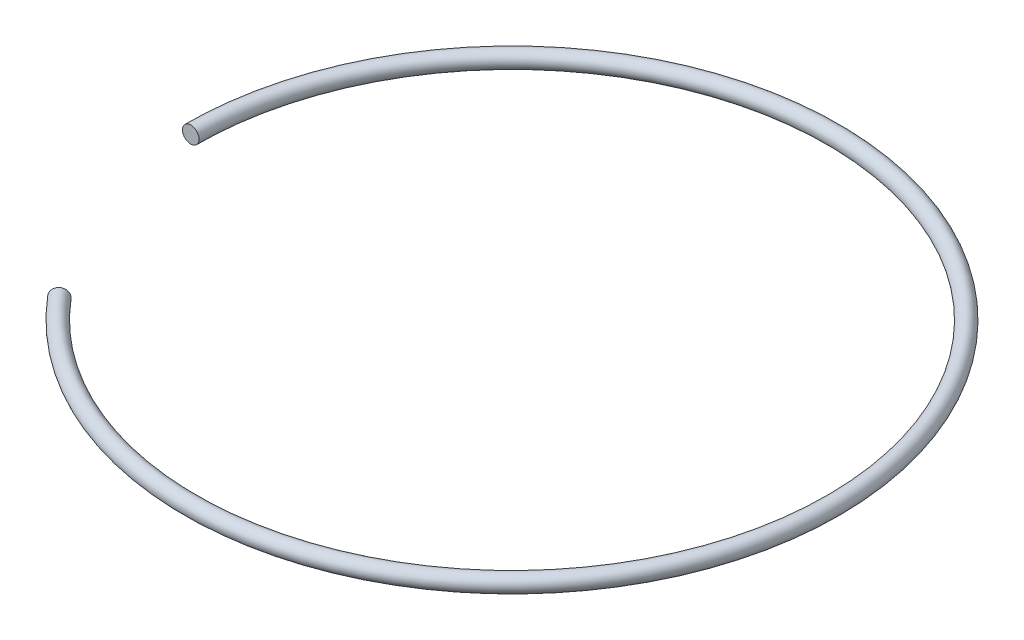
ISO-10303-21;
HEADER;
FILE_DESCRIPTION(('STEP AP214'),'2;1');
FILE_NAME('part.step','',(''),(''),'','','');
FILE_SCHEMA(('AUTOMOTIVE_DESIGN { 1 0 10303 214 1 1 1 1 }'));
ENDSEC;
DATA;
#1=APPLICATION_CONTEXT('core data for automotive mechanical design processes');
#2=APPLICATION_PROTOCOL_DEFINITION('international standard','automotive_design',2000,#1);
#3=PRODUCT_CONTEXT('',#1,'mechanical');
#4=PRODUCT('Part','Part','',(#3));
#5=PRODUCT_RELATED_PRODUCT_CATEGORY('part','',(#4));
#6=PRODUCT_DEFINITION_FORMATION('','',#4);
#7=PRODUCT_DEFINITION_CONTEXT('part definition',#1,'design');
#8=PRODUCT_DEFINITION('design','',#6,#7);
#9=PRODUCT_DEFINITION_SHAPE('','',#8);
#10=(LENGTH_UNIT() NAMED_UNIT(*) SI_UNIT(.MILLI.,.METRE.));
#11=(NAMED_UNIT(*) PLANE_ANGLE_UNIT() SI_UNIT($,.RADIAN.));
#12=(NAMED_UNIT(*) SI_UNIT($,.STERADIAN.) SOLID_ANGLE_UNIT());
#13=UNCERTAINTY_MEASURE_WITH_UNIT(LENGTH_MEASURE(1.E-05),#10,'distance_accuracy_value','');
#14=(GEOMETRIC_REPRESENTATION_CONTEXT(3) GLOBAL_UNCERTAINTY_ASSIGNED_CONTEXT((#13)) GLOBAL_UNIT_ASSIGNED_CONTEXT((#10,
#11,#12)) REPRESENTATION_CONTEXT('',''));
#15=CARTESIAN_POINT('',(0.,0.,0.));
#16=DIRECTION('',(0.,0.,1.));
#17=DIRECTION('',(1.,0.,0.));
#18=AXIS2_PLACEMENT_3D('',#15,#16,#17);
#19=CARTESIAN_POINT('',(0.,0.,0.));
#20=DIRECTION('',(0.64278760968653,0.,0.766044443118986));
#21=DIRECTION('',(0.766044443118986,0.,-0.64278760968653));
#22=AXIS2_PLACEMENT_3D('',#19,#20,#21);
#23=PLANE('',#22);
#24=CARTESIAN_POINT('',(-4.32815110362227,4.56,3.6317499947289));
#25=CARTESIAN_POINT('',(-4.32815924654829,4.57680750835501,3.63175682745513));
#26=CARTESIAN_POINT('',(-4.33035377603358,4.59371844128932,3.63359825633683));
#27=CARTESIAN_POINT('',(-4.33890328620022,4.62558323599696,3.64077214716439));
#28=CARTESIAN_POINT('',(-4.34525826688157,4.64053709777029,3.64610460911025));
#29=CARTESIAN_POINT('',(-4.36140279869268,4.66687074596776,3.65965147979849));
#30=CARTESIAN_POINT('',(-4.37119234982253,4.67825053239179,3.66786588854095));
#31=CARTESIAN_POINT('',(-4.39310484980576,4.6961346650492,3.68625265919505));
#32=CARTESIAN_POINT('',(-4.40522779865915,4.70263901128258,3.6964250211067));
#33=CARTESIAN_POINT('',(-4.43043962883601,4.71004353855515,3.7175802585094));
#34=CARTESIAN_POINT('',(-4.44352851015949,4.71094371959435,3.72856313400046));
#35=CARTESIAN_POINT('',(-4.46919678722053,4.70703844536533,3.75010137581533));
#36=CARTESIAN_POINT('',(-4.48177618295809,4.70223299009711,3.76065674213915));
#37=CARTESIAN_POINT('',(-4.50500693603773,4.68745356130633,3.78014965848025));
#38=CARTESIAN_POINT('',(-4.51565829337981,4.67747958778377,3.78908720849752));
#39=CARTESIAN_POINT('',(-4.53383314136039,4.65350623717002,3.80433771673473));
#40=CARTESIAN_POINT('',(-4.5413566319989,4.63950686007882,3.81065067495467));
#41=CARTESIAN_POINT('',(-4.55242372570428,4.60899118714949,3.81993706920106));
#42=CARTESIAN_POINT('',(-4.55596732877116,4.59247489131134,3.82291050522752));
#43=CARTESIAN_POINT('',(-4.55775482710825,4.57052398291492,3.8244103944229));
#44=CARTESIAN_POINT('',(-4.5579669883556,4.5652670698381,3.8245884188473));
#45=CARTESIAN_POINT('',(-4.55795629363194,4.54319249164499,3.82457944490862));
#46=CARTESIAN_POINT('',(-4.55576176414665,4.52628155871068,3.82273801602691));
#47=CARTESIAN_POINT('',(-4.54721225398002,4.49441676400304,3.81556412519934));
#48=CARTESIAN_POINT('',(-4.54085727329867,4.4794629022297,3.81023166325349));
#49=CARTESIAN_POINT('',(-4.52471274148756,4.45312925403224,3.79668479256525));
#50=CARTESIAN_POINT('',(-4.51492319035771,4.4417494676082,3.7884703838228));
#51=CARTESIAN_POINT('',(-4.49301069037447,4.42386533495079,3.7700836131687));
#52=CARTESIAN_POINT('',(-4.48088774152109,4.41736098871742,3.75991125125704));
#53=CARTESIAN_POINT('',(-4.45567591134423,4.40995646144485,3.73875601385433));
#54=CARTESIAN_POINT('',(-4.44258703002075,4.40905628040565,3.72777313836328));
#55=CARTESIAN_POINT('',(-4.41691875295971,4.41296155463467,3.70623489654841));
#56=CARTESIAN_POINT('',(-4.40433935722215,4.41776700990289,3.69567953022459));
#57=CARTESIAN_POINT('',(-4.38110860414251,4.43254643869367,3.6761866138835));
#58=CARTESIAN_POINT('',(-4.37045724680043,4.44252041221623,3.66724906386622));
#59=CARTESIAN_POINT('',(-4.35228239881984,4.46649376282998,3.65199855562902));
#60=CARTESIAN_POINT('',(-4.34475890818133,4.48049313992117,3.64568559740908));
#61=CARTESIAN_POINT('',(-4.33369181447595,4.51100881285051,3.63639920316268));
#62=CARTESIAN_POINT('',(-4.33014821140908,4.52752510868866,3.63342576713621));
#63=CARTESIAN_POINT('',(-4.32836071307199,4.54947601708507,3.63192587794084));
#64=CARTESIAN_POINT('',(-4.32814855182463,4.5547329301619,3.63174785351644));
#65=CARTESIAN_POINT('',(-4.32815110362227,4.56,3.6317499947289));
#66=B_SPLINE_CURVE_WITH_KNOTS('',3,(#24,#25,#26,#27,#28,#29,#30,#31,#32,#33,#34,#35,#36,#37,#38,
#39,#40,#41,#42,#43,#44,#45,#46,#47,#48,#49,#50,#51,#52,#53,#54,#55,#56,#57,#58,#59,#60,#61,#62,
#63,#64,#65),.UNSPECIFIED.,.T.,.F.,(4,2,2,2,2,2,2,2,2,2,2,2,2,2,2,2,2,2,2,2,4),(0.,
0.050365705795551,0.100731411591102,0.151097117387923,0.201462823184745,0.251828528981567,
0.302194234778389,0.352559940575211,0.402925646372032,0.453291352168854,0.46907475588743,
0.51944046168298,0.56980616747853,0.620171873275352,0.670537579072174,0.720903284868997,
0.771268990665818,0.821634696462641,0.872000402259462,0.922366108056283,0.938149511774858),.UNSPECIFIED.);
#67=CARTESIAN_POINT('',(-4.32815110362227,4.56,3.6317499947289));
#68=VERTEX_POINT('',#67);
#69=EDGE_CURVE('E18',#68,#68,#66,.T.);
#70=ORIENTED_EDGE('',*,*,#69,.F.);
#71=EDGE_LOOP('',(#70));
#72=FACE_BOUND('',#71,.T.);
#73=ADVANCED_FACE('F14',(#72),#23,.F.);
#74=CARTESIAN_POINT('',(0.,0.,0.));
#75=DIRECTION('',(0.,0.,1.));
#76=DIRECTION('',(1.,0.,0.));
#77=AXIS2_PLACEMENT_3D('',#74,#75,#76);
#78=PLANE('',#77);
#79=CARTESIAN_POINT('',(-5.95,4.56,0.));
#80=CARTESIAN_POINT('',(-5.94998937016501,4.57680750835501,0.));
#81=CARTESIAN_POINT('',(-5.94712461537826,4.59371844128932,0.));
#82=CARTESIAN_POINT('',(-5.93596402248651,4.62558323599696,0.));
#83=CARTESIAN_POINT('',(-5.92766818438152,4.64053709777029,0.));
#84=CARTESIAN_POINT('',(-5.90659299487243,4.66687074596776,0.));
#85=CARTESIAN_POINT('',(-5.89381364346823,4.67825053239179,0.));
#86=CARTESIAN_POINT('',(-5.86520890626262,4.6961346650492,0.));
#87=CARTESIAN_POINT('',(-5.84938352046122,4.70263901128258,0.));
#88=CARTESIAN_POINT('',(-5.81647181357094,4.71004353855515,0.));
#89=CARTESIAN_POINT('',(-5.79938549248206,4.71094371959435,0.));
#90=CARTESIAN_POINT('',(-5.76587793650198,4.70703844536533,0.));
#91=CARTESIAN_POINT('',(-5.74945670161078,4.70223299009711,0.));
#92=CARTESIAN_POINT('',(-5.71913110720394,4.68745356130633,0.));
#93=CARTESIAN_POINT('',(-5.70522674768831,4.67747958778377,0.));
#94=CARTESIAN_POINT('',(-5.68150116865194,4.65350623717002,0.));
#95=CARTESIAN_POINT('',(-5.67167994913122,4.63950686007882,0.));
#96=CARTESIAN_POINT('',(-5.65723288433648,4.60899118714949,0.));
#97=CARTESIAN_POINT('',(-5.65260703906247,4.59247489131134,0.));
#98=CARTESIAN_POINT('',(-5.65027362570358,4.57052398291492,0.));
#99=CARTESIAN_POINT('',(-5.64999666886477,4.5652670698381,0.));
#100=CARTESIAN_POINT('',(-5.65001062983499,4.54319249164499,0.));
#101=CARTESIAN_POINT('',(-5.65287538462174,4.52628155871068,0.));
#102=CARTESIAN_POINT('',(-5.66403597751348,4.49441676400304,0.));
#103=CARTESIAN_POINT('',(-5.67233181561848,4.4794629022297,0.));
#104=CARTESIAN_POINT('',(-5.69340700512756,4.45312925403224,0.));
#105=CARTESIAN_POINT('',(-5.70618635653177,4.4417494676082,0.));
#106=CARTESIAN_POINT('',(-5.73479109373737,4.42386533495079,0.));
#107=CARTESIAN_POINT('',(-5.75061647953878,4.41736098871742,0.));
#108=CARTESIAN_POINT('',(-5.78352818642906,4.40995646144485,0.));
#109=CARTESIAN_POINT('',(-5.80061450751794,4.40905628040565,0.));
#110=CARTESIAN_POINT('',(-5.83412206349802,4.41296155463467,0.));
#111=CARTESIAN_POINT('',(-5.85054329838922,4.41776700990289,0.));
#112=CARTESIAN_POINT('',(-5.88086889279606,4.43254643869367,0.));
#113=CARTESIAN_POINT('',(-5.89477325231169,4.44252041221623,0.));
#114=CARTESIAN_POINT('',(-5.91849883134805,4.46649376282998,0.));
#115=CARTESIAN_POINT('',(-5.92832005086878,4.48049313992117,0.));
#116=CARTESIAN_POINT('',(-5.94276711566352,4.51100881285051,0.));
#117=CARTESIAN_POINT('',(-5.94739296093752,4.52752510868866,0.));
#118=CARTESIAN_POINT('',(-5.94972637429642,4.54947601708507,0.));
#119=CARTESIAN_POINT('',(-5.95000333113523,4.5547329301619,0.));
#120=CARTESIAN_POINT('',(-5.95,4.56,0.));
#121=B_SPLINE_CURVE_WITH_KNOTS('',3,(#79,#80,#81,#82,#83,#84,#85,#86,#87,#88,#89,#90,#91,#92,
#93,#94,#95,#96,#97,#98,#99,#100,#101,#102,#103,#104,#105,#106,#107,#108,#109,#110,#111,#112,
#113,#114,#115,#116,#117,#118,#119,#120),.UNSPECIFIED.,.T.,.F.,(4,2,2,2,2,2,2,2,2,2,2,2,2,2,2,2,
2,2,2,2,4),(0.,0.0503657057955509,0.100731411591102,0.151097117387923,0.201462823184745,
0.251828528981567,0.302194234778388,0.352559940575211,0.402925646372033,0.453291352168854,
0.469074755887429,0.51944046168298,0.56980616747853,0.620171873275352,0.670537579072174,
0.720903284868996,0.771268990665818,0.821634696462639,0.872000402259461,0.922366108056283,
0.938149511774857),.UNSPECIFIED.);
#122=CARTESIAN_POINT('',(-5.95,4.56,0.));
#123=VERTEX_POINT('',#122);
#124=EDGE_CURVE('E10',#123,#123,#121,.T.);
#125=ORIENTED_EDGE('',*,*,#124,.F.);
#126=EDGE_LOOP('',(#125));
#127=FACE_BOUND('',#126,.T.);
#128=ADVANCED_FACE('F36',(#127),#78,.T.);
#129=CARTESIAN_POINT('',(0.,4.56,0.));
#130=DIRECTION('',(0.,1.,0.));
#131=DIRECTION('',(0.,0.,1.));
#132=AXIS2_PLACEMENT_3D('',#129,#130,#131);
#133=TOROIDAL_SURFACE('',#132,5.8,0.150000000000001);
#134=ORIENTED_EDGE('',*,*,#124,.T.);
#135=EDGE_LOOP('',(#134));
#136=FACE_BOUND('',#135,.T.);
#137=ORIENTED_EDGE('',*,*,#69,.T.);
#138=EDGE_LOOP('',(#137));
#139=FACE_BOUND('',#138,.T.);
#140=ADVANCED_FACE('F34',(#136,#139),#133,.T.);
#141=CLOSED_SHELL('',(#73,#128,#140));
#142=MANIFOLD_SOLID_BREP('B1',#141);
#143=ADVANCED_BREP_SHAPE_REPRESENTATION('',(#18,#142),#14);
#144=SHAPE_DEFINITION_REPRESENTATION(#9,#143);
ENDSEC;
END-ISO-10303-21;
